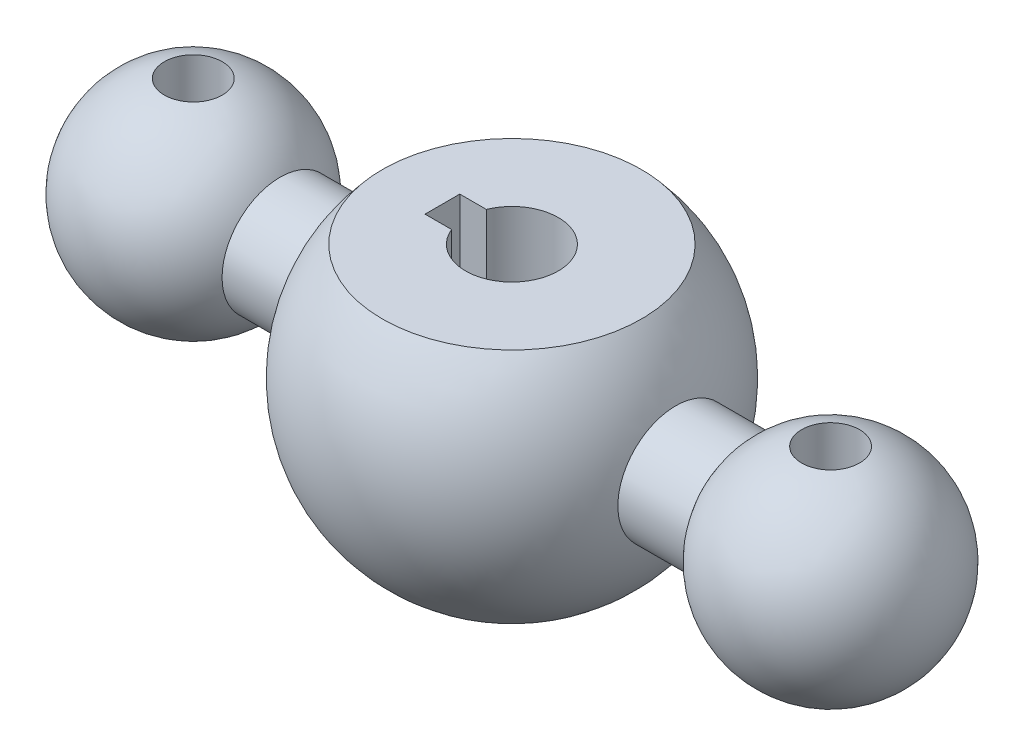
ISO-10303-21;
HEADER;
FILE_DESCRIPTION(('STEP AP214'),'2;1');
FILE_NAME('part.step','',(''),(''),'','','');
FILE_SCHEMA(('AUTOMOTIVE_DESIGN { 1 0 10303 214 1 1 1 1 }'));
ENDSEC;
DATA;
#1=APPLICATION_CONTEXT('core data for automotive mechanical design processes');
#2=APPLICATION_PROTOCOL_DEFINITION('international standard','automotive_design',2000,#1);
#3=PRODUCT_CONTEXT('',#1,'mechanical');
#4=PRODUCT('Part','Part','',(#3));
#5=PRODUCT_RELATED_PRODUCT_CATEGORY('part','',(#4));
#6=PRODUCT_DEFINITION_FORMATION('','',#4);
#7=PRODUCT_DEFINITION_CONTEXT('part definition',#1,'design');
#8=PRODUCT_DEFINITION('design','',#6,#7);
#9=PRODUCT_DEFINITION_SHAPE('','',#8);
#10=(LENGTH_UNIT() NAMED_UNIT(*) SI_UNIT(.MILLI.,.METRE.));
#11=(NAMED_UNIT(*) PLANE_ANGLE_UNIT() SI_UNIT($,.RADIAN.));
#12=(NAMED_UNIT(*) SI_UNIT($,.STERADIAN.) SOLID_ANGLE_UNIT());
#13=UNCERTAINTY_MEASURE_WITH_UNIT(LENGTH_MEASURE(1.E-05),#10,'distance_accuracy_value','');
#14=(GEOMETRIC_REPRESENTATION_CONTEXT(3) GLOBAL_UNCERTAINTY_ASSIGNED_CONTEXT((#13)) GLOBAL_UNIT_ASSIGNED_CONTEXT((#10,
#11,#12)) REPRESENTATION_CONTEXT('',''));
#15=CARTESIAN_POINT('',(0.,0.,0.));
#16=DIRECTION('',(0.,0.,1.));
#17=DIRECTION('',(1.,0.,0.));
#18=AXIS2_PLACEMENT_3D('',#15,#16,#17);
#19=CARTESIAN_POINT('',(0.,10.,0.));
#20=DIRECTION('',(0.,-1.,0.));
#21=DIRECTION('',(0.,0.,-1.));
#22=AXIS2_PLACEMENT_3D('',#19,#20,#21);
#23=PLANE('',#22);
#24=DIRECTION('',(0.,0.,1.));
#25=VECTOR('',#24,1.);
#26=CARTESIAN_POINT('',(-6.,10.,-1.5));
#27=LINE('',#26,#25);
#28=CARTESIAN_POINT('',(-6.,10.,-1.5));
#29=VERTEX_POINT('',#28);
#30=CARTESIAN_POINT('',(-6.,10.,1.5));
#31=VERTEX_POINT('',#30);
#32=EDGE_CURVE('E101',#29,#31,#27,.T.);
#33=ORIENTED_EDGE('',*,*,#32,.F.);
#34=DIRECTION('',(-1.,0.,0.));
#35=VECTOR('',#34,1.);
#36=CARTESIAN_POINT('',(-6.,10.,-1.5));
#37=LINE('',#36,#35);
#38=CARTESIAN_POINT('',(-3.70809924354783,10.,-1.5));
#39=VERTEX_POINT('',#38);
#40=EDGE_CURVE('E65',#39,#29,#37,.T.);
#41=ORIENTED_EDGE('',*,*,#40,.F.);
#42=CARTESIAN_POINT('',(0.,10.,0.));
#43=DIRECTION('',(0.,1.,0.));
#44=DIRECTION('',(0.,0.,-1.));
#45=AXIS2_PLACEMENT_3D('',#42,#43,#44);
#46=CIRCLE('',#45,4.);
#47=CARTESIAN_POINT('',(-3.70809924354783,10.,1.5));
#48=VERTEX_POINT('',#47);
#49=EDGE_CURVE('E107',#48,#39,#46,.T.);
#50=ORIENTED_EDGE('',*,*,#49,.F.);
#51=DIRECTION('',(1.,0.,0.));
#52=VECTOR('',#51,1.);
#53=CARTESIAN_POINT('',(-6.,10.,1.5));
#54=LINE('',#53,#52);
#55=EDGE_CURVE('E93',#31,#48,#54,.T.);
#56=ORIENTED_EDGE('',*,*,#55,.F.);
#57=EDGE_LOOP('',(#33,#41,#50,#56));
#58=FACE_BOUND('',#57,.T.);
#59=CARTESIAN_POINT('',(0.,10.,0.));
#60=DIRECTION('',(0.,1.,0.));
#61=DIRECTION('',(0.,0.,1.));
#62=AXIS2_PLACEMENT_3D('',#59,#60,#61);
#63=CIRCLE('',#62,11.1803398874989);
#64=CARTESIAN_POINT('',(0.,10.,11.1803398874989));
#65=VERTEX_POINT('',#64);
#66=EDGE_CURVE('E127',#65,#65,#63,.T.);
#67=ORIENTED_EDGE('',*,*,#66,.T.);
#68=EDGE_LOOP('',(#67));
#69=FACE_BOUND('',#68,.T.);
#70=ADVANCED_FACE('F50',(#58,#69),#23,.F.);
#71=CARTESIAN_POINT('',(0.,0.,0.));
#72=DIRECTION('',(0.,1.,0.));
#73=DIRECTION('',(1.,0.,0.));
#74=AXIS2_PLACEMENT_3D('',#71,#72,#73);
#75=SPHERICAL_SURFACE('',#74,15.);
#76=CARTESIAN_POINT('',(-14.142135623731,0.,0.));
#77=DIRECTION('',(1.,0.,0.));
#78=DIRECTION('',(0.,0.,-1.));
#79=AXIS2_PLACEMENT_3D('',#76,#77,#78);
#80=CIRCLE('',#79,5.);
#81=CARTESIAN_POINT('',(-14.142135623731,0.,-5.));
#82=VERTEX_POINT('',#81);
#83=EDGE_CURVE('E164',#82,#82,#80,.T.);
#84=ORIENTED_EDGE('',*,*,#83,.T.);
#85=EDGE_LOOP('',(#84));
#86=FACE_BOUND('',#85,.T.);
#87=CARTESIAN_POINT('',(14.142135623731,0.,0.));
#88=DIRECTION('',(1.,0.,0.));
#89=DIRECTION('',(0.,0.,-1.));
#90=AXIS2_PLACEMENT_3D('',#87,#88,#89);
#91=CIRCLE('',#90,5.);
#92=CARTESIAN_POINT('',(14.142135623731,0.,-5.));
#93=VERTEX_POINT('',#92);
#94=EDGE_CURVE('E166',#93,#93,#91,.T.);
#95=ORIENTED_EDGE('',*,*,#94,.F.);
#96=EDGE_LOOP('',(#95));
#97=FACE_BOUND('',#96,.T.);
#98=ORIENTED_EDGE('',*,*,#66,.F.);
#99=EDGE_LOOP('',(#98));
#100=FACE_BOUND('',#99,.T.);
#101=CARTESIAN_POINT('',(0.,-12.,0.));
#102=DIRECTION('',(0.,1.,0.));
#103=DIRECTION('',(0.,0.,1.));
#104=AXIS2_PLACEMENT_3D('',#101,#102,#103);
#105=CIRCLE('',#104,9.);
#106=CARTESIAN_POINT('',(0.,-12.,9.));
#107=VERTEX_POINT('',#106);
#108=EDGE_CURVE('E117',#107,#107,#105,.T.);
#109=ORIENTED_EDGE('',*,*,#108,.T.);
#110=EDGE_LOOP('',(#109));
#111=FACE_BOUND('',#110,.T.);
#112=ADVANCED_FACE('F147',(#86,#97,#100,#111),#75,.T.);
#113=CARTESIAN_POINT('',(9.,-12.,0.));
#114=DIRECTION('',(0.,1.,0.));
#115=DIRECTION('',(0.,0.,1.));
#116=AXIS2_PLACEMENT_3D('',#113,#114,#115);
#117=PLANE('',#116);
#118=CARTESIAN_POINT('',(0.,-12.,0.));
#119=DIRECTION('',(0.,1.,0.));
#120=DIRECTION('',(0.,0.,1.));
#121=AXIS2_PLACEMENT_3D('',#118,#119,#120);
#122=CIRCLE('',#121,4.);
#123=CARTESIAN_POINT('',(-3.70809924354783,-12.,1.5));
#124=VERTEX_POINT('',#123);
#125=CARTESIAN_POINT('',(-3.70809924354783,-12.,-1.5));
#126=VERTEX_POINT('',#125);
#127=EDGE_CURVE('E54',#124,#126,#122,.T.);
#128=ORIENTED_EDGE('',*,*,#127,.T.);
#129=DIRECTION('',(-1.,0.,0.));
#130=VECTOR('',#129,1.);
#131=CARTESIAN_POINT('',(9.,-12.,-1.5));
#132=LINE('',#131,#130);
#133=CARTESIAN_POINT('',(-6.,-12.,-1.5));
#134=VERTEX_POINT('',#133);
#135=EDGE_CURVE('E11',#126,#134,#132,.T.);
#136=ORIENTED_EDGE('',*,*,#135,.T.);
#137=DIRECTION('',(0.,0.,1.));
#138=VECTOR('',#137,1.);
#139=CARTESIAN_POINT('',(-6.,-12.,0.));
#140=LINE('',#139,#138);
#141=CARTESIAN_POINT('',(-6.,-12.,1.5));
#142=VERTEX_POINT('',#141);
#143=EDGE_CURVE('E128',#134,#142,#140,.T.);
#144=ORIENTED_EDGE('',*,*,#143,.T.);
#145=DIRECTION('',(1.,0.,0.));
#146=VECTOR('',#145,1.);
#147=CARTESIAN_POINT('',(9.,-12.,1.5));
#148=LINE('',#147,#146);
#149=EDGE_CURVE('E94',#142,#124,#148,.T.);
#150=ORIENTED_EDGE('',*,*,#149,.T.);
#151=EDGE_LOOP('',(#128,#136,#144,#150));
#152=FACE_BOUND('',#151,.T.);
#153=ORIENTED_EDGE('',*,*,#108,.F.);
#154=EDGE_LOOP('',(#153));
#155=FACE_BOUND('',#154,.T.);
#156=ADVANCED_FACE('F140',(#152,#155),#117,.F.);
#157=CARTESIAN_POINT('',(-6.,-15.,-1.5));
#158=DIRECTION('',(0.,0.,-1.));
#159=DIRECTION('',(-1.,0.,0.));
#160=AXIS2_PLACEMENT_3D('',#157,#158,#159);
#161=PLANE('',#160);
#162=DIRECTION('',(0.,1.,0.));
#163=VECTOR('',#162,1.);
#164=CARTESIAN_POINT('',(-3.70809924354783,-15.,-1.5));
#165=LINE('',#164,#163);
#166=EDGE_CURVE('E113',#126,#39,#165,.T.);
#167=ORIENTED_EDGE('',*,*,#166,.T.);
#168=ORIENTED_EDGE('',*,*,#40,.T.);
#169=DIRECTION('',(0.,1.,0.));
#170=VECTOR('',#169,1.);
#171=CARTESIAN_POINT('',(-6.,-15.,-1.5));
#172=LINE('',#171,#170);
#173=EDGE_CURVE('E98',#134,#29,#172,.T.);
#174=ORIENTED_EDGE('',*,*,#173,.F.);
#175=ORIENTED_EDGE('',*,*,#135,.F.);
#176=EDGE_LOOP('',(#167,#168,#174,#175));
#177=FACE_BOUND('',#176,.T.);
#178=ADVANCED_FACE('F142',(#177),#161,.F.);
#179=CARTESIAN_POINT('',(0.,-15.,0.));
#180=DIRECTION('',(0.,1.,0.));
#181=DIRECTION('',(0.,0.,1.));
#182=AXIS2_PLACEMENT_3D('',#179,#180,#181);
#183=CYLINDRICAL_SURFACE('',#182,4.);
#184=DIRECTION('',(0.,1.,0.));
#185=VECTOR('',#184,1.);
#186=CARTESIAN_POINT('',(-3.70809924354783,-15.,1.5));
#187=LINE('',#186,#185);
#188=EDGE_CURVE('E100',#124,#48,#187,.T.);
#189=ORIENTED_EDGE('',*,*,#188,.T.);
#190=ORIENTED_EDGE('',*,*,#49,.T.);
#191=ORIENTED_EDGE('',*,*,#166,.F.);
#192=ORIENTED_EDGE('',*,*,#127,.F.);
#193=EDGE_LOOP('',(#189,#190,#191,#192));
#194=FACE_BOUND('',#193,.T.);
#195=ADVANCED_FACE('F143',(#194),#183,.F.);
#196=CARTESIAN_POINT('',(-6.,-15.,1.5));
#197=DIRECTION('',(0.,0.,1.));
#198=DIRECTION('',(1.,0.,0.));
#199=AXIS2_PLACEMENT_3D('',#196,#197,#198);
#200=PLANE('',#199);
#201=DIRECTION('',(0.,1.,0.));
#202=VECTOR('',#201,1.);
#203=CARTESIAN_POINT('',(-6.,-15.,1.5));
#204=LINE('',#203,#202);
#205=EDGE_CURVE('E66',#142,#31,#204,.T.);
#206=ORIENTED_EDGE('',*,*,#205,.T.);
#207=ORIENTED_EDGE('',*,*,#55,.T.);
#208=ORIENTED_EDGE('',*,*,#188,.F.);
#209=ORIENTED_EDGE('',*,*,#149,.F.);
#210=EDGE_LOOP('',(#206,#207,#208,#209));
#211=FACE_BOUND('',#210,.T.);
#212=ADVANCED_FACE('F86',(#211),#200,.F.);
#213=CARTESIAN_POINT('',(-6.,-15.,-1.5));
#214=DIRECTION('',(-1.,0.,0.));
#215=DIRECTION('',(0.,0.,1.));
#216=AXIS2_PLACEMENT_3D('',#213,#214,#215);
#217=PLANE('',#216);
#218=ORIENTED_EDGE('',*,*,#173,.T.);
#219=ORIENTED_EDGE('',*,*,#32,.T.);
#220=ORIENTED_EDGE('',*,*,#205,.F.);
#221=ORIENTED_EDGE('',*,*,#143,.F.);
#222=EDGE_LOOP('',(#218,#219,#220,#221));
#223=FACE_BOUND('',#222,.T.);
#224=ADVANCED_FACE('F105',(#223),#217,.F.);
#225=CARTESIAN_POINT('',(20.0166852264521,0.,0.));
#226=DIRECTION('',(1.,0.,0.));
#227=DIRECTION('',(0.,0.,-1.));
#228=AXIS2_PLACEMENT_3D('',#225,#226,#227);
#229=CYLINDRICAL_SURFACE('',#228,5.);
#230=ORIENTED_EDGE('',*,*,#94,.T.);
#231=EDGE_LOOP('',(#230));
#232=FACE_BOUND('',#231,.T.);
#233=CARTESIAN_POINT('',(20.0166852264521,0.,0.));
#234=DIRECTION('',(1.,0.,0.));
#235=DIRECTION('',(0.,0.,-1.));
#236=AXIS2_PLACEMENT_3D('',#233,#234,#235);
#237=CIRCLE('',#236,5.);
#238=CARTESIAN_POINT('',(20.0166852264521,0.,-5.));
#239=VERTEX_POINT('',#238);
#240=EDGE_CURVE('E174',#239,#239,#237,.T.);
#241=ORIENTED_EDGE('',*,*,#240,.F.);
#242=EDGE_LOOP('',(#241));
#243=FACE_BOUND('',#242,.T.);
#244=ADVANCED_FACE('F247',(#232,#243),#229,.T.);
#245=CARTESIAN_POINT('',(27.5,0.,0.));
#246=DIRECTION('',(-1.,0.,0.));
#247=DIRECTION('',(0.,0.,1.));
#248=AXIS2_PLACEMENT_3D('',#245,#246,#247);
#249=SPHERICAL_SURFACE('',#248,8.99999999999999);
#250=ORIENTED_EDGE('',*,*,#240,.T.);
#251=EDGE_LOOP('',(#250));
#252=FACE_BOUND('',#251,.T.);
#253=CARTESIAN_POINT('',(27.5,-8.,0.));
#254=DIRECTION('',(0.,-1.,0.));
#255=DIRECTION('',(0.,0.,-1.));
#256=AXIS2_PLACEMENT_3D('',#253,#254,#255);
#257=CIRCLE('',#256,4.12310562561765);
#258=CARTESIAN_POINT('',(27.5,-8.,-4.12310562561766));
#259=VERTEX_POINT('',#258);
#260=EDGE_CURVE('E176',#259,#259,#257,.F.);
#261=ORIENTED_EDGE('',*,*,#260,.T.);
#262=EDGE_LOOP('',(#261));
#263=FACE_BOUND('',#262,.T.);
#264=CARTESIAN_POINT('',(27.5,8.64580823289529,0.));
#265=DIRECTION('',(0.,-1.,0.));
#266=DIRECTION('',(0.,0.,-1.));
#267=AXIS2_PLACEMENT_3D('',#264,#265,#266);
#268=CIRCLE('',#267,2.5);
#269=CARTESIAN_POINT('',(27.5,8.64580823289529,-2.5));
#270=VERTEX_POINT('',#269);
#271=EDGE_CURVE('E190',#270,#270,#268,.T.);
#272=ORIENTED_EDGE('',*,*,#271,.T.);
#273=EDGE_LOOP('',(#272));
#274=FACE_BOUND('',#273,.T.);
#275=ADVANCED_FACE('F245',(#252,#263,#274),#249,.T.);
#276=CARTESIAN_POINT('',(23.3768943743824,-8.,25.));
#277=DIRECTION('',(0.,-1.,0.));
#278=DIRECTION('',(0.,0.,-1.));
#279=AXIS2_PLACEMENT_3D('',#276,#277,#278);
#280=PLANE('',#279);
#281=CARTESIAN_POINT('',(27.5,-8.,0.));
#282=DIRECTION('',(0.,-1.,0.));
#283=DIRECTION('',(0.,0.,-1.));
#284=AXIS2_PLACEMENT_3D('',#281,#282,#283);
#285=CIRCLE('',#284,2.5);
#286=CARTESIAN_POINT('',(27.5,-8.,-2.5));
#287=VERTEX_POINT('',#286);
#288=EDGE_CURVE('E181',#287,#287,#285,.F.);
#289=ORIENTED_EDGE('',*,*,#288,.T.);
#290=EDGE_LOOP('',(#289));
#291=FACE_BOUND('',#290,.T.);
#292=ORIENTED_EDGE('',*,*,#260,.F.);
#293=EDGE_LOOP('',(#292));
#294=FACE_BOUND('',#293,.T.);
#295=ADVANCED_FACE('F236',(#291,#294),#280,.T.);
#296=CARTESIAN_POINT('',(27.5,25.,0.));
#297=DIRECTION('',(0.,-1.,0.));
#298=DIRECTION('',(0.,0.,-1.));
#299=AXIS2_PLACEMENT_3D('',#296,#297,#298);
#300=CYLINDRICAL_SURFACE('',#299,2.5);
#301=ORIENTED_EDGE('',*,*,#271,.F.);
#302=EDGE_LOOP('',(#301));
#303=FACE_BOUND('',#302,.T.);
#304=ORIENTED_EDGE('',*,*,#288,.F.);
#305=EDGE_LOOP('',(#304));
#306=FACE_BOUND('',#305,.T.);
#307=ADVANCED_FACE('F233',(#303,#306),#300,.F.);
#308=CARTESIAN_POINT('',(-4.56358040508534,0.,0.));
#309=DIRECTION('',(1.,0.,0.));
#310=DIRECTION('',(0.,0.,-1.));
#311=AXIS2_PLACEMENT_3D('',#308,#309,#310);
#312=CYLINDRICAL_SURFACE('',#311,5.);
#313=CARTESIAN_POINT('',(-20.0166852264521,0.,0.));
#314=DIRECTION('',(-1.,0.,0.));
#315=DIRECTION('',(0.,0.,1.));
#316=AXIS2_PLACEMENT_3D('',#313,#314,#315);
#317=CIRCLE('',#316,5.);
#318=CARTESIAN_POINT('',(-20.0166852264521,0.,5.));
#319=VERTEX_POINT('',#318);
#320=EDGE_CURVE('E198',#319,#319,#317,.T.);
#321=ORIENTED_EDGE('',*,*,#320,.F.);
#322=EDGE_LOOP('',(#321));
#323=FACE_BOUND('',#322,.T.);
#324=ORIENTED_EDGE('',*,*,#83,.F.);
#325=EDGE_LOOP('',(#324));
#326=FACE_BOUND('',#325,.T.);
#327=ADVANCED_FACE('F227',(#323,#326),#312,.T.);
#328=CARTESIAN_POINT('',(-27.5,0.,0.));
#329=DIRECTION('',(1.,0.,0.));
#330=DIRECTION('',(0.,0.,1.));
#331=AXIS2_PLACEMENT_3D('',#328,#329,#330);
#332=SPHERICAL_SURFACE('',#331,9.);
#333=ORIENTED_EDGE('',*,*,#320,.T.);
#334=EDGE_LOOP('',(#333));
#335=FACE_BOUND('',#334,.T.);
#336=CARTESIAN_POINT('',(-27.5,-8.,0.));
#337=DIRECTION('',(0.,1.,0.));
#338=DIRECTION('',(0.,0.,1.));
#339=AXIS2_PLACEMENT_3D('',#336,#337,#338);
#340=CIRCLE('',#339,4.12310562561766);
#341=CARTESIAN_POINT('',(-27.5,-8.,4.12310562561767));
#342=VERTEX_POINT('',#341);
#343=EDGE_CURVE('E199',#342,#342,#340,.F.);
#344=ORIENTED_EDGE('',*,*,#343,.F.);
#345=EDGE_LOOP('',(#344));
#346=FACE_BOUND('',#345,.T.);
#347=CARTESIAN_POINT('',(-27.5,8.64580823289529,0.));
#348=DIRECTION('',(0.,-1.,0.));
#349=DIRECTION('',(0.,0.,-1.));
#350=AXIS2_PLACEMENT_3D('',#347,#348,#349);
#351=CIRCLE('',#350,2.5);
#352=CARTESIAN_POINT('',(-27.5,8.64580823289529,-2.5));
#353=VERTEX_POINT('',#352);
#354=EDGE_CURVE('E202',#353,#353,#351,.T.);
#355=ORIENTED_EDGE('',*,*,#354,.T.);
#356=EDGE_LOOP('',(#355));
#357=FACE_BOUND('',#356,.T.);
#358=ADVANCED_FACE('F213',(#335,#346,#357),#332,.T.);
#359=CARTESIAN_POINT('',(-31.6231056256177,-8.,25.));
#360=DIRECTION('',(0.,1.,0.));
#361=DIRECTION('',(0.,0.,1.));
#362=AXIS2_PLACEMENT_3D('',#359,#360,#361);
#363=PLANE('',#362);
#364=CARTESIAN_POINT('',(-27.5,-8.,0.));
#365=DIRECTION('',(0.,1.,0.));
#366=DIRECTION('',(0.,0.,1.));
#367=AXIS2_PLACEMENT_3D('',#364,#365,#366);
#368=CIRCLE('',#367,2.5);
#369=CARTESIAN_POINT('',(-27.5,-8.,2.5));
#370=VERTEX_POINT('',#369);
#371=EDGE_CURVE('E203',#370,#370,#368,.F.);
#372=ORIENTED_EDGE('',*,*,#371,.F.);
#373=EDGE_LOOP('',(#372));
#374=FACE_BOUND('',#373,.T.);
#375=ORIENTED_EDGE('',*,*,#343,.T.);
#376=EDGE_LOOP('',(#375));
#377=FACE_BOUND('',#376,.T.);
#378=ADVANCED_FACE('F217',(#374,#377),#363,.F.);
#379=CARTESIAN_POINT('',(-27.5,25.,0.));
#380=DIRECTION('',(0.,-1.,0.));
#381=DIRECTION('',(0.,0.,-1.));
#382=AXIS2_PLACEMENT_3D('',#379,#380,#381);
#383=CYLINDRICAL_SURFACE('',#382,2.5);
#384=ORIENTED_EDGE('',*,*,#354,.F.);
#385=EDGE_LOOP('',(#384));
#386=FACE_BOUND('',#385,.T.);
#387=ORIENTED_EDGE('',*,*,#371,.T.);
#388=EDGE_LOOP('',(#387));
#389=FACE_BOUND('',#388,.T.);
#390=ADVANCED_FACE('F214',(#386,#389),#383,.F.);
#391=CLOSED_SHELL('',(#70,#112,#156,#178,#195,#212,#224,#244,#275,#295,#307,#327,#358,#378,#390));
#392=MANIFOLD_SOLID_BREP('B2',#391);
#393=ADVANCED_BREP_SHAPE_REPRESENTATION('',(#18,#392),#14);
#394=SHAPE_DEFINITION_REPRESENTATION(#9,#393);
ENDSEC;
END-ISO-10303-21;
